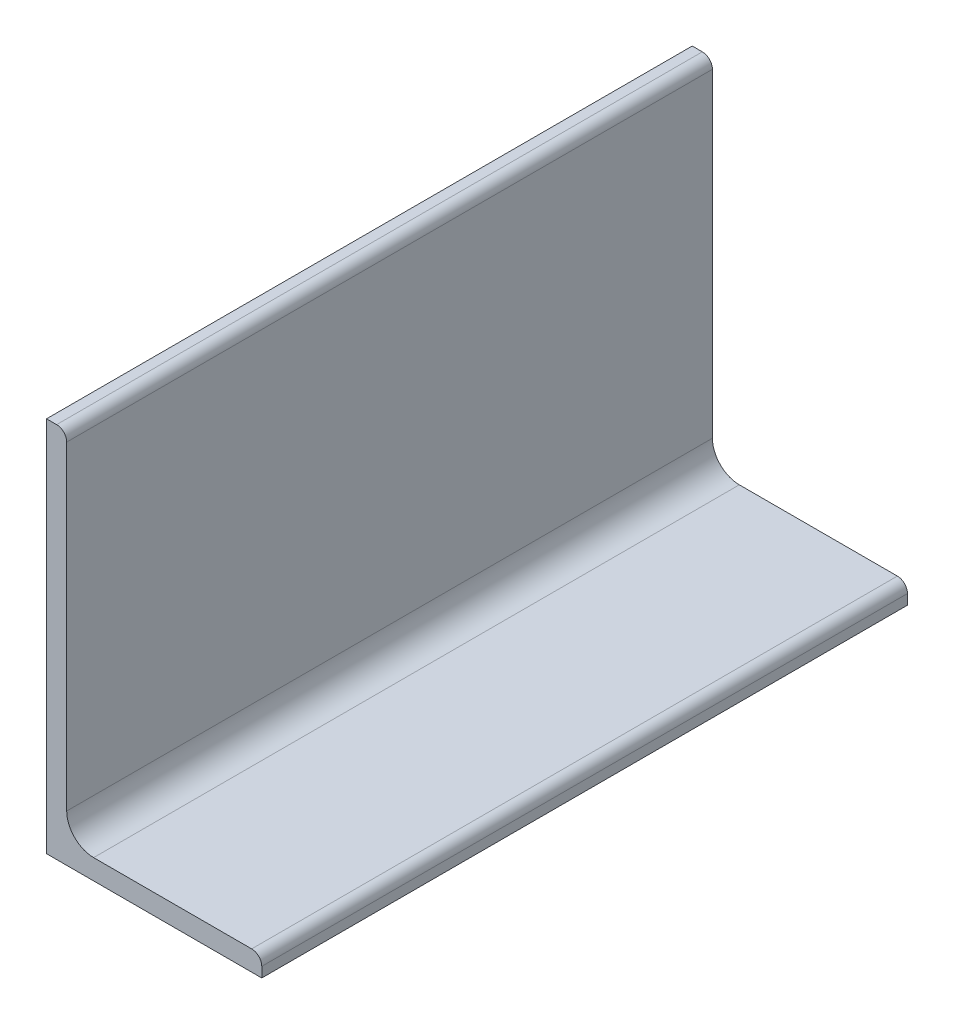
ISO-10303-21;
HEADER;
FILE_DESCRIPTION(('STEP AP214'),'2;1');
FILE_NAME('part.step','',(''),(''),'','','');
FILE_SCHEMA(('AUTOMOTIVE_DESIGN { 1 0 10303 214 1 1 1 1 }'));
ENDSEC;
DATA;
#1=APPLICATION_CONTEXT('core data for automotive mechanical design processes');
#2=APPLICATION_PROTOCOL_DEFINITION('international standard','automotive_design',2000,#1);
#3=PRODUCT_CONTEXT('',#1,'mechanical');
#4=PRODUCT('Part','Part','',(#3));
#5=PRODUCT_RELATED_PRODUCT_CATEGORY('part','',(#4));
#6=PRODUCT_DEFINITION_FORMATION('','',#4);
#7=PRODUCT_DEFINITION_CONTEXT('part definition',#1,'design');
#8=PRODUCT_DEFINITION('design','',#6,#7);
#9=PRODUCT_DEFINITION_SHAPE('','',#8);
#10=(LENGTH_UNIT() NAMED_UNIT(*) SI_UNIT(.MILLI.,.METRE.));
#11=(NAMED_UNIT(*) PLANE_ANGLE_UNIT() SI_UNIT($,.RADIAN.));
#12=(NAMED_UNIT(*) SI_UNIT($,.STERADIAN.) SOLID_ANGLE_UNIT());
#13=UNCERTAINTY_MEASURE_WITH_UNIT(LENGTH_MEASURE(1.E-05),#10,'distance_accuracy_value','');
#14=(GEOMETRIC_REPRESENTATION_CONTEXT(3) GLOBAL_UNCERTAINTY_ASSIGNED_CONTEXT((#13)) GLOBAL_UNIT_ASSIGNED_CONTEXT((#10,
#11,#12)) REPRESENTATION_CONTEXT('',''));
#15=CARTESIAN_POINT('',(0.,0.,0.));
#16=DIRECTION('',(0.,0.,1.));
#17=DIRECTION('',(1.,0.,0.));
#18=AXIS2_PLACEMENT_3D('',#15,#16,#17);
#19=CARTESIAN_POINT('',(0.865045893659089,178.809200992538,304.8));
#20=DIRECTION('',(1.,0.,0.));
#21=DIRECTION('',(0.,0.,-1.));
#22=AXIS2_PLACEMENT_3D('',#19,#20,#21);
#23=PLANE('',#22);
#24=DIRECTION('',(0.,-1.,0.));
#25=VECTOR('',#24,1.);
#26=CARTESIAN_POINT('',(0.865045893659089,178.809200992538,0.));
#27=LINE('',#26,#25);
#28=CARTESIAN_POINT('',(0.865045893659089,178.809200992538,0.));
#29=VERTEX_POINT('',#28);
#30=CARTESIAN_POINT('',(0.865045893659089,1.00920099253831,0.));
#31=VERTEX_POINT('',#30);
#32=EDGE_CURVE('E135',#29,#31,#27,.T.);
#33=ORIENTED_EDGE('',*,*,#32,.T.);
#34=DIRECTION('',(0.,0.,-1.));
#35=VECTOR('',#34,1.);
#36=CARTESIAN_POINT('',(0.865045893659089,1.00920099253831,304.8));
#37=LINE('',#36,#35);
#38=CARTESIAN_POINT('',(0.865045893659089,1.00920099253831,304.8));
#39=VERTEX_POINT('',#38);
#40=EDGE_CURVE('E11',#39,#31,#37,.T.);
#41=ORIENTED_EDGE('',*,*,#40,.F.);
#42=DIRECTION('',(0.,-1.,0.));
#43=VECTOR('',#42,1.);
#44=CARTESIAN_POINT('',(0.865045893659089,178.809200992538,304.8));
#45=LINE('',#44,#43);
#46=CARTESIAN_POINT('',(0.865045893659089,178.809200992538,304.8));
#47=VERTEX_POINT('',#46);
#48=EDGE_CURVE('E151',#47,#39,#45,.T.);
#49=ORIENTED_EDGE('',*,*,#48,.F.);
#50=DIRECTION('',(0.,0.,-1.));
#51=VECTOR('',#50,1.);
#52=CARTESIAN_POINT('',(0.865045893659089,178.809200992538,304.8));
#53=LINE('',#52,#51);
#54=EDGE_CURVE('E131',#47,#29,#53,.T.);
#55=ORIENTED_EDGE('',*,*,#54,.T.);
#56=EDGE_LOOP('',(#33,#41,#49,#55));
#57=FACE_BOUND('',#56,.T.);
#58=ADVANCED_FACE('F33',(#57),#23,.F.);
#59=CARTESIAN_POINT('',(0.865045893659089,1.00920099253831,304.8));
#60=DIRECTION('',(0.,1.,0.));
#61=DIRECTION('',(0.,0.,1.));
#62=AXIS2_PLACEMENT_3D('',#59,#60,#61);
#63=PLANE('',#62);
#64=DIRECTION('',(1.,0.,0.));
#65=VECTOR('',#64,1.);
#66=CARTESIAN_POINT('',(0.865045893659089,1.00920099253831,0.));
#67=LINE('',#66,#65);
#68=CARTESIAN_POINT('',(102.465045893659,1.00920099253831,0.));
#69=VERTEX_POINT('',#68);
#70=EDGE_CURVE('E138',#31,#69,#67,.T.);
#71=ORIENTED_EDGE('',*,*,#70,.T.);
#72=DIRECTION('',(0.,0.,-1.));
#73=VECTOR('',#72,1.);
#74=CARTESIAN_POINT('',(102.465045893659,1.00920099253831,304.8));
#75=LINE('',#74,#73);
#76=CARTESIAN_POINT('',(102.465045893659,1.00920099253831,304.8));
#77=VERTEX_POINT('',#76);
#78=EDGE_CURVE('E41',#77,#69,#75,.T.);
#79=ORIENTED_EDGE('',*,*,#78,.F.);
#80=DIRECTION('',(1.,0.,0.));
#81=VECTOR('',#80,1.);
#82=CARTESIAN_POINT('',(0.865045893659089,1.00920099253831,304.8));
#83=LINE('',#82,#81);
#84=EDGE_CURVE('E95',#39,#77,#83,.T.);
#85=ORIENTED_EDGE('',*,*,#84,.F.);
#86=ORIENTED_EDGE('',*,*,#40,.T.);
#87=EDGE_LOOP('',(#71,#79,#85,#86));
#88=FACE_BOUND('',#87,.T.);
#89=ADVANCED_FACE('F194',(#88),#63,.F.);
#90=CARTESIAN_POINT('',(102.465045893659,1.00920099253831,304.8));
#91=DIRECTION('',(-1.,0.,0.));
#92=DIRECTION('',(0.,0.,1.));
#93=AXIS2_PLACEMENT_3D('',#90,#91,#92);
#94=PLANE('',#93);
#95=DIRECTION('',(0.,1.,0.));
#96=VECTOR('',#95,1.);
#97=CARTESIAN_POINT('',(102.465045893659,1.00920099253831,0.));
#98=LINE('',#97,#96);
#99=CARTESIAN_POINT('',(102.465045893659,5.77170099253831,0.));
#100=VERTEX_POINT('',#99);
#101=EDGE_CURVE('E140',#69,#100,#98,.T.);
#102=ORIENTED_EDGE('',*,*,#101,.T.);
#103=DIRECTION('',(0.,0.,-1.));
#104=VECTOR('',#103,1.);
#105=CARTESIAN_POINT('',(102.465045893659,5.77170099253831,304.8));
#106=LINE('',#105,#104);
#107=CARTESIAN_POINT('',(102.465045893659,5.77170099253831,304.8));
#108=VERTEX_POINT('',#107);
#109=EDGE_CURVE('E161',#108,#100,#106,.T.);
#110=ORIENTED_EDGE('',*,*,#109,.F.);
#111=DIRECTION('',(0.,1.,0.));
#112=VECTOR('',#111,1.);
#113=CARTESIAN_POINT('',(102.465045893659,1.00920099253831,304.8));
#114=LINE('',#113,#112);
#115=EDGE_CURVE('E169',#77,#108,#114,.T.);
#116=ORIENTED_EDGE('',*,*,#115,.F.);
#117=ORIENTED_EDGE('',*,*,#78,.T.);
#118=EDGE_LOOP('',(#102,#110,#116,#117));
#119=FACE_BOUND('',#118,.T.);
#120=ADVANCED_FACE('F167',(#119),#94,.F.);
#121=CARTESIAN_POINT('',(97.7025458936591,5.77170099253831,304.8));
#122=DIRECTION('',(0.,0.,-1.));
#123=DIRECTION('',(-1.,0.,0.));
#124=AXIS2_PLACEMENT_3D('',#121,#122,#123);
#125=CYLINDRICAL_SURFACE('',#124,4.7625);
#126=CARTESIAN_POINT('',(97.7025458936591,5.77170099253831,0.));
#127=DIRECTION('',(0.,0.,1.));
#128=DIRECTION('',(1.,0.,0.));
#129=AXIS2_PLACEMENT_3D('',#126,#127,#128);
#130=CIRCLE('',#129,4.7625);
#131=CARTESIAN_POINT('',(97.7025458936591,10.5342009925383,0.));
#132=VERTEX_POINT('',#131);
#133=EDGE_CURVE('E142',#100,#132,#130,.T.);
#134=ORIENTED_EDGE('',*,*,#133,.T.);
#135=DIRECTION('',(0.,0.,-1.));
#136=VECTOR('',#135,1.);
#137=CARTESIAN_POINT('',(97.7025458936591,10.5342009925383,304.8));
#138=LINE('',#137,#136);
#139=CARTESIAN_POINT('',(97.7025458936591,10.5342009925383,304.8));
#140=VERTEX_POINT('',#139);
#141=EDGE_CURVE('E158',#140,#132,#138,.T.);
#142=ORIENTED_EDGE('',*,*,#141,.F.);
#143=CARTESIAN_POINT('',(97.7025458936591,5.77170099253831,304.8));
#144=DIRECTION('',(0.,0.,1.));
#145=DIRECTION('',(1.,0.,0.));
#146=AXIS2_PLACEMENT_3D('',#143,#144,#145);
#147=CIRCLE('',#146,4.7625);
#148=EDGE_CURVE('E185',#108,#140,#147,.T.);
#149=ORIENTED_EDGE('',*,*,#148,.F.);
#150=ORIENTED_EDGE('',*,*,#109,.T.);
#151=EDGE_LOOP('',(#134,#142,#149,#150));
#152=FACE_BOUND('',#151,.T.);
#153=ADVANCED_FACE('F178',(#152),#125,.T.);
#154=CARTESIAN_POINT('',(97.7025458936591,10.5342009925383,304.8));
#155=DIRECTION('',(0.,-1.,0.));
#156=DIRECTION('',(0.,0.,-1.));
#157=AXIS2_PLACEMENT_3D('',#154,#155,#156);
#158=PLANE('',#157);
#159=DIRECTION('',(-1.,0.,0.));
#160=VECTOR('',#159,1.);
#161=CARTESIAN_POINT('',(97.7025458936591,10.5342009925383,0.));
#162=LINE('',#161,#160);
#163=CARTESIAN_POINT('',(23.0900458936591,10.5342009925383,0.));
#164=VERTEX_POINT('',#163);
#165=EDGE_CURVE('E144',#132,#164,#162,.T.);
#166=ORIENTED_EDGE('',*,*,#165,.T.);
#167=DIRECTION('',(0.,0.,-1.));
#168=VECTOR('',#167,1.);
#169=CARTESIAN_POINT('',(23.0900458936591,10.5342009925383,304.8));
#170=LINE('',#169,#168);
#171=CARTESIAN_POINT('',(23.0900458936591,10.5342009925383,304.8));
#172=VERTEX_POINT('',#171);
#173=EDGE_CURVE('E155',#172,#164,#170,.T.);
#174=ORIENTED_EDGE('',*,*,#173,.F.);
#175=DIRECTION('',(-1.,0.,0.));
#176=VECTOR('',#175,1.);
#177=CARTESIAN_POINT('',(97.7025458936591,10.5342009925383,304.8));
#178=LINE('',#177,#176);
#179=EDGE_CURVE('E184',#140,#172,#178,.T.);
#180=ORIENTED_EDGE('',*,*,#179,.F.);
#181=ORIENTED_EDGE('',*,*,#141,.T.);
#182=EDGE_LOOP('',(#166,#174,#180,#181));
#183=FACE_BOUND('',#182,.T.);
#184=ADVANCED_FACE('F182',(#183),#158,.F.);
#185=CARTESIAN_POINT('',(23.0900458936591,23.2342009925383,304.8));
#186=DIRECTION('',(0.,0.,-1.));
#187=DIRECTION('',(-1.,0.,0.));
#188=AXIS2_PLACEMENT_3D('',#185,#186,#187);
#189=CYLINDRICAL_SURFACE('',#188,12.7);
#190=CARTESIAN_POINT('',(23.0900458936591,23.2342009925383,0.));
#191=DIRECTION('',(0.,0.,-1.));
#192=DIRECTION('',(1.,0.,0.));
#193=AXIS2_PLACEMENT_3D('',#190,#191,#192);
#194=CIRCLE('',#193,12.7);
#195=CARTESIAN_POINT('',(10.3900458936591,23.2342009925383,0.));
#196=VERTEX_POINT('',#195);
#197=EDGE_CURVE('E146',#164,#196,#194,.T.);
#198=ORIENTED_EDGE('',*,*,#197,.T.);
#199=DIRECTION('',(0.,0.,-1.));
#200=VECTOR('',#199,1.);
#201=CARTESIAN_POINT('',(10.3900458936591,23.2342009925383,304.8));
#202=LINE('',#201,#200);
#203=CARTESIAN_POINT('',(10.3900458936591,23.2342009925383,304.8));
#204=VERTEX_POINT('',#203);
#205=EDGE_CURVE('E126',#204,#196,#202,.T.);
#206=ORIENTED_EDGE('',*,*,#205,.F.);
#207=CARTESIAN_POINT('',(23.0900458936591,23.2342009925383,304.8));
#208=DIRECTION('',(0.,0.,-1.));
#209=DIRECTION('',(1.,0.,0.));
#210=AXIS2_PLACEMENT_3D('',#207,#208,#209);
#211=CIRCLE('',#210,12.7);
#212=EDGE_CURVE('E117',#172,#204,#211,.T.);
#213=ORIENTED_EDGE('',*,*,#212,.F.);
#214=ORIENTED_EDGE('',*,*,#173,.T.);
#215=EDGE_LOOP('',(#198,#206,#213,#214));
#216=FACE_BOUND('',#215,.T.);
#217=ADVANCED_FACE('F206',(#216),#189,.F.);
#218=CARTESIAN_POINT('',(10.3900458936591,23.2342009925383,304.8));
#219=DIRECTION('',(-1.,0.,0.));
#220=DIRECTION('',(0.,0.,1.));
#221=AXIS2_PLACEMENT_3D('',#218,#219,#220);
#222=PLANE('',#221);
#223=DIRECTION('',(0.,1.,0.));
#224=VECTOR('',#223,1.);
#225=CARTESIAN_POINT('',(10.3900458936591,23.2342009925383,0.));
#226=LINE('',#225,#224);
#227=CARTESIAN_POINT('',(10.3900458936591,174.046700992538,0.));
#228=VERTEX_POINT('',#227);
#229=EDGE_CURVE('E125',#196,#228,#226,.T.);
#230=ORIENTED_EDGE('',*,*,#229,.T.);
#231=DIRECTION('',(0.,0.,-1.));
#232=VECTOR('',#231,1.);
#233=CARTESIAN_POINT('',(10.3900458936591,174.046700992538,304.8));
#234=LINE('',#233,#232);
#235=CARTESIAN_POINT('',(10.3900458936591,174.046700992538,304.8));
#236=VERTEX_POINT('',#235);
#237=EDGE_CURVE('E122',#236,#228,#234,.T.);
#238=ORIENTED_EDGE('',*,*,#237,.F.);
#239=DIRECTION('',(0.,1.,0.));
#240=VECTOR('',#239,1.);
#241=CARTESIAN_POINT('',(10.3900458936591,23.2342009925383,304.8));
#242=LINE('',#241,#240);
#243=EDGE_CURVE('E111',#204,#236,#242,.T.);
#244=ORIENTED_EDGE('',*,*,#243,.F.);
#245=ORIENTED_EDGE('',*,*,#205,.T.);
#246=EDGE_LOOP('',(#230,#238,#244,#245));
#247=FACE_BOUND('',#246,.T.);
#248=ADVANCED_FACE('F123',(#247),#222,.F.);
#249=CARTESIAN_POINT('',(5.62754589365909,174.046700992538,304.8));
#250=DIRECTION('',(0.,0.,-1.));
#251=DIRECTION('',(-1.,0.,0.));
#252=AXIS2_PLACEMENT_3D('',#249,#250,#251);
#253=CYLINDRICAL_SURFACE('',#252,4.7625);
#254=CARTESIAN_POINT('',(5.62754589365909,174.046700992538,0.));
#255=DIRECTION('',(0.,0.,1.));
#256=DIRECTION('',(1.,0.,0.));
#257=AXIS2_PLACEMENT_3D('',#254,#255,#256);
#258=CIRCLE('',#257,4.7625);
#259=CARTESIAN_POINT('',(5.62754589365909,178.809200992538,0.));
#260=VERTEX_POINT('',#259);
#261=EDGE_CURVE('E81',#228,#260,#258,.T.);
#262=ORIENTED_EDGE('',*,*,#261,.T.);
#263=DIRECTION('',(0.,0.,-1.));
#264=VECTOR('',#263,1.);
#265=CARTESIAN_POINT('',(5.62754589365909,178.809200992538,304.8));
#266=LINE('',#265,#264);
#267=CARTESIAN_POINT('',(5.62754589365909,178.809200992538,304.8));
#268=VERTEX_POINT('',#267);
#269=EDGE_CURVE('E127',#268,#260,#266,.T.);
#270=ORIENTED_EDGE('',*,*,#269,.F.);
#271=CARTESIAN_POINT('',(5.62754589365909,174.046700992538,304.8));
#272=DIRECTION('',(0.,0.,1.));
#273=DIRECTION('',(1.,0.,0.));
#274=AXIS2_PLACEMENT_3D('',#271,#272,#273);
#275=CIRCLE('',#274,4.7625);
#276=EDGE_CURVE('E115',#236,#268,#275,.T.);
#277=ORIENTED_EDGE('',*,*,#276,.F.);
#278=ORIENTED_EDGE('',*,*,#237,.T.);
#279=EDGE_LOOP('',(#262,#270,#277,#278));
#280=FACE_BOUND('',#279,.T.);
#281=ADVANCED_FACE('F129',(#280),#253,.T.);
#282=CARTESIAN_POINT('',(5.62754589365909,178.809200992538,304.8));
#283=DIRECTION('',(0.,-1.,0.));
#284=DIRECTION('',(0.,0.,-1.));
#285=AXIS2_PLACEMENT_3D('',#282,#283,#284);
#286=PLANE('',#285);
#287=DIRECTION('',(-1.,0.,0.));
#288=VECTOR('',#287,1.);
#289=CARTESIAN_POINT('',(5.62754589365909,178.809200992538,0.));
#290=LINE('',#289,#288);
#291=EDGE_CURVE('E87',#260,#29,#290,.T.);
#292=ORIENTED_EDGE('',*,*,#291,.T.);
#293=ORIENTED_EDGE('',*,*,#54,.F.);
#294=DIRECTION('',(-1.,0.,0.));
#295=VECTOR('',#294,1.);
#296=CARTESIAN_POINT('',(5.62754589365909,178.809200992538,304.8));
#297=LINE('',#296,#295);
#298=EDGE_CURVE('E49',#268,#47,#297,.T.);
#299=ORIENTED_EDGE('',*,*,#298,.F.);
#300=ORIENTED_EDGE('',*,*,#269,.T.);
#301=EDGE_LOOP('',(#292,#293,#299,#300));
#302=FACE_BOUND('',#301,.T.);
#303=ADVANCED_FACE('F214',(#302),#286,.F.);
#304=CARTESIAN_POINT('',(97.7025458936591,5.77170099253831,304.8));
#305=DIRECTION('',(0.,0.,1.));
#306=DIRECTION('',(1.,0.,0.));
#307=AXIS2_PLACEMENT_3D('',#304,#305,#306);
#308=PLANE('',#307);
#309=ORIENTED_EDGE('',*,*,#48,.T.);
#310=ORIENTED_EDGE('',*,*,#84,.T.);
#311=ORIENTED_EDGE('',*,*,#115,.T.);
#312=ORIENTED_EDGE('',*,*,#148,.T.);
#313=ORIENTED_EDGE('',*,*,#179,.T.);
#314=ORIENTED_EDGE('',*,*,#212,.T.);
#315=ORIENTED_EDGE('',*,*,#243,.T.);
#316=ORIENTED_EDGE('',*,*,#276,.T.);
#317=ORIENTED_EDGE('',*,*,#298,.T.);
#318=EDGE_LOOP('',(#309,#310,#311,#312,#313,#314,#315,#316,#317));
#319=FACE_BOUND('',#318,.T.);
#320=ADVANCED_FACE('F113',(#319),#308,.T.);
#321=CARTESIAN_POINT('',(97.7025458936591,5.77170099253831,0.));
#322=DIRECTION('',(0.,0.,1.));
#323=DIRECTION('',(1.,0.,0.));
#324=AXIS2_PLACEMENT_3D('',#321,#322,#323);
#325=PLANE('',#324);
#326=ORIENTED_EDGE('',*,*,#32,.F.);
#327=ORIENTED_EDGE('',*,*,#291,.F.);
#328=ORIENTED_EDGE('',*,*,#261,.F.);
#329=ORIENTED_EDGE('',*,*,#229,.F.);
#330=ORIENTED_EDGE('',*,*,#197,.F.);
#331=ORIENTED_EDGE('',*,*,#165,.F.);
#332=ORIENTED_EDGE('',*,*,#133,.F.);
#333=ORIENTED_EDGE('',*,*,#101,.F.);
#334=ORIENTED_EDGE('',*,*,#70,.F.);
#335=EDGE_LOOP('',(#326,#327,#328,#329,#330,#331,#332,#333,#334));
#336=FACE_BOUND('',#335,.T.);
#337=ADVANCED_FACE('F173',(#336),#325,.F.);
#338=CLOSED_SHELL('',(#58,#89,#120,#153,#184,#217,#248,#281,#303,#320,#337));
#339=MANIFOLD_SOLID_BREP('B2',#338);
#340=ADVANCED_BREP_SHAPE_REPRESENTATION('',(#18,#339),#14);
#341=SHAPE_DEFINITION_REPRESENTATION(#9,#340);
ENDSEC;
END-ISO-10303-21;
